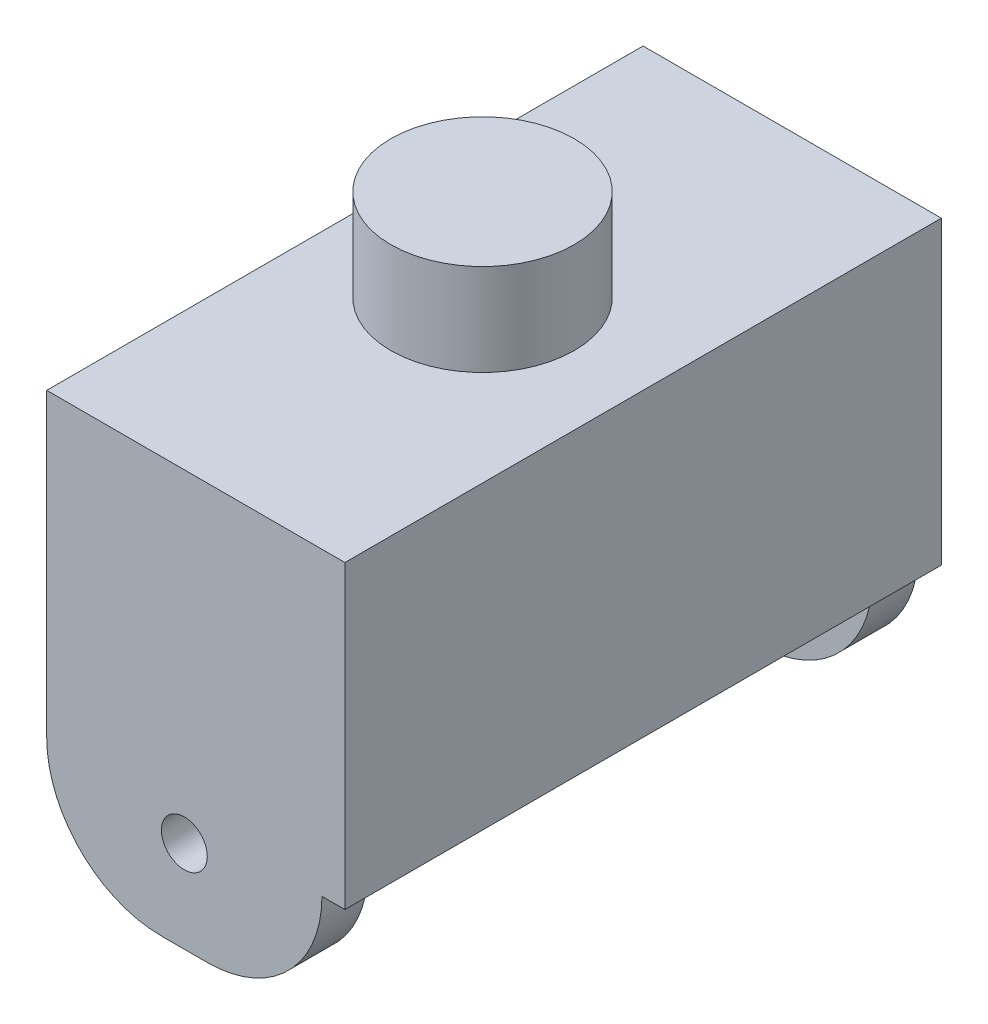
ISO-10303-21;
HEADER;
FILE_DESCRIPTION(('STEP AP214'),'2;1');
FILE_NAME('part.step','',(''),(''),'','','');
FILE_SCHEMA(('AUTOMOTIVE_DESIGN { 1 0 10303 214 1 1 1 1 }'));
ENDSEC;
DATA;
#1=APPLICATION_CONTEXT('core data for automotive mechanical design processes');
#2=APPLICATION_PROTOCOL_DEFINITION('international standard','automotive_design',2000,#1);
#3=PRODUCT_CONTEXT('',#1,'mechanical');
#4=PRODUCT('Part','Part','',(#3));
#5=PRODUCT_RELATED_PRODUCT_CATEGORY('part','',(#4));
#6=PRODUCT_DEFINITION_FORMATION('','',#4);
#7=PRODUCT_DEFINITION_CONTEXT('part definition',#1,'design');
#8=PRODUCT_DEFINITION('design','',#6,#7);
#9=PRODUCT_DEFINITION_SHAPE('','',#8);
#10=(LENGTH_UNIT() NAMED_UNIT(*) SI_UNIT(.MILLI.,.METRE.));
#11=(NAMED_UNIT(*) PLANE_ANGLE_UNIT() SI_UNIT($,.RADIAN.));
#12=(NAMED_UNIT(*) SI_UNIT($,.STERADIAN.) SOLID_ANGLE_UNIT());
#13=UNCERTAINTY_MEASURE_WITH_UNIT(LENGTH_MEASURE(1.E-05),#10,'distance_accuracy_value','');
#14=(GEOMETRIC_REPRESENTATION_CONTEXT(3) GLOBAL_UNCERTAINTY_ASSIGNED_CONTEXT((#13)) GLOBAL_UNIT_ASSIGNED_CONTEXT((#10,
#11,#12)) REPRESENTATION_CONTEXT('',''));
#15=CARTESIAN_POINT('',(0.,0.,0.));
#16=DIRECTION('',(0.,0.,1.));
#17=DIRECTION('',(1.,0.,0.));
#18=AXIS2_PLACEMENT_3D('',#15,#16,#17);
#19=CARTESIAN_POINT('',(-4.99999999999999,-25.,0.));
#20=DIRECTION('',(0.,0.,1.));
#21=DIRECTION('',(1.,0.,0.));
#22=AXIS2_PLACEMENT_3D('',#19,#20,#21);
#23=PLANE('',#22);
#24=CARTESIAN_POINT('',(0.,-30.,0.));
#25=DIRECTION('',(0.,0.,1.));
#26=DIRECTION('',(1.,0.,0.));
#27=AXIS2_PLACEMENT_3D('',#24,#25,#26);
#28=CIRCLE('',#27,5.);
#29=CARTESIAN_POINT('',(5.00000000000001,-30.,0.));
#30=VERTEX_POINT('',#29);
#31=EDGE_CURVE('E232',#30,#30,#28,.T.);
#32=ORIENTED_EDGE('',*,*,#31,.T.);
#33=EDGE_LOOP('',(#32));
#34=FACE_BOUND('',#33,.T.);
#35=DIRECTION('',(-1.,0.,0.));
#36=VECTOR('',#35,1.);
#37=CARTESIAN_POINT('',(-30.,30.5119118435241,0.));
#38=LINE('',#37,#36);
#39=CARTESIAN_POINT('',(25.,30.5119118435241,0.));
#40=VERTEX_POINT('',#39);
#41=CARTESIAN_POINT('',(-30.,30.5119118435241,0.));
#42=VERTEX_POINT('',#41);
#43=EDGE_CURVE('E50',#40,#42,#38,.T.);
#44=ORIENTED_EDGE('',*,*,#43,.F.);
#45=DIRECTION('',(0.,1.,0.));
#46=VECTOR('',#45,1.);
#47=CARTESIAN_POINT('',(25.,30.5119118435241,0.));
#48=LINE('',#47,#46);
#49=CARTESIAN_POINT('',(25.,-25.,0.));
#50=VERTEX_POINT('',#49);
#51=EDGE_CURVE('E220',#50,#40,#48,.T.);
#52=ORIENTED_EDGE('',*,*,#51,.F.);
#53=DIRECTION('',(-1.,0.,0.));
#54=VECTOR('',#53,1.);
#55=CARTESIAN_POINT('',(30.,-25.,0.));
#56=LINE('',#55,#54);
#57=CARTESIAN_POINT('',(30.,-25.,0.));
#58=VERTEX_POINT('',#57);
#59=EDGE_CURVE('E218',#58,#50,#56,.T.);
#60=ORIENTED_EDGE('',*,*,#59,.F.);
#61=CARTESIAN_POINT('',(5.00000000000001,-25.,0.));
#62=DIRECTION('',(0.,0.,1.));
#63=DIRECTION('',(1.,0.,0.));
#64=AXIS2_PLACEMENT_3D('',#61,#62,#63);
#65=CIRCLE('',#64,25.);
#66=CARTESIAN_POINT('',(5.,-50.,0.));
#67=VERTEX_POINT('',#66);
#68=EDGE_CURVE('E241',#67,#58,#65,.T.);
#69=ORIENTED_EDGE('',*,*,#68,.F.);
#70=DIRECTION('',(1.,0.,0.));
#71=VECTOR('',#70,1.);
#72=CARTESIAN_POINT('',(-4.99999999999999,-50.,0.));
#73=LINE('',#72,#71);
#74=CARTESIAN_POINT('',(-4.99999999999999,-50.,0.));
#75=VERTEX_POINT('',#74);
#76=EDGE_CURVE('E252',#75,#67,#73,.T.);
#77=ORIENTED_EDGE('',*,*,#76,.F.);
#78=CARTESIAN_POINT('',(-4.99999999999999,-25.,0.));
#79=DIRECTION('',(0.,0.,1.));
#80=DIRECTION('',(1.,0.,0.));
#81=AXIS2_PLACEMENT_3D('',#78,#79,#80);
#82=CIRCLE('',#81,25.);
#83=CARTESIAN_POINT('',(-30.,-25.,0.));
#84=VERTEX_POINT('',#83);
#85=EDGE_CURVE('E250',#84,#75,#82,.T.);
#86=ORIENTED_EDGE('',*,*,#85,.F.);
#87=DIRECTION('',(0.,-1.,0.));
#88=VECTOR('',#87,1.);
#89=CARTESIAN_POINT('',(-30.,40.5119118435241,0.));
#90=LINE('',#89,#88);
#91=EDGE_CURVE('E55',#42,#84,#90,.T.);
#92=ORIENTED_EDGE('',*,*,#91,.F.);
#93=EDGE_LOOP('',(#44,#52,#60,#69,#77,#86,#92));
#94=FACE_BOUND('',#93,.T.);
#95=ADVANCED_FACE('F34',(#34,#94),#23,.F.);
#96=CARTESIAN_POINT('',(-4.99999999999999,-25.,10.));
#97=DIRECTION('',(0.,0.,1.));
#98=DIRECTION('',(1.,0.,0.));
#99=AXIS2_PLACEMENT_3D('',#96,#97,#98);
#100=PLANE('',#99);
#101=DIRECTION('',(0.,-1.,0.));
#102=VECTOR('',#101,1.);
#103=CARTESIAN_POINT('',(-30.,40.5119118435241,10.));
#104=LINE('',#103,#102);
#105=CARTESIAN_POINT('',(-30.,40.5119118435241,10.));
#106=VERTEX_POINT('',#105);
#107=CARTESIAN_POINT('',(-30.,-25.,10.));
#108=VERTEX_POINT('',#107);
#109=EDGE_CURVE('E238',#106,#108,#104,.T.);
#110=ORIENTED_EDGE('',*,*,#109,.T.);
#111=CARTESIAN_POINT('',(-4.99999999999999,-25.,10.));
#112=DIRECTION('',(0.,0.,1.));
#113=DIRECTION('',(1.,0.,0.));
#114=AXIS2_PLACEMENT_3D('',#111,#112,#113);
#115=CIRCLE('',#114,25.);
#116=CARTESIAN_POINT('',(-4.99999999999999,-50.,10.));
#117=VERTEX_POINT('',#116);
#118=EDGE_CURVE('E240',#108,#117,#115,.T.);
#119=ORIENTED_EDGE('',*,*,#118,.T.);
#120=DIRECTION('',(1.,0.,0.));
#121=VECTOR('',#120,1.);
#122=CARTESIAN_POINT('',(-4.99999999999999,-50.,10.));
#123=LINE('',#122,#121);
#124=CARTESIAN_POINT('',(5.,-50.,10.));
#125=VERTEX_POINT('',#124);
#126=EDGE_CURVE('E243',#117,#125,#123,.T.);
#127=ORIENTED_EDGE('',*,*,#126,.T.);
#128=CARTESIAN_POINT('',(5.00000000000001,-25.,10.));
#129=DIRECTION('',(0.,0.,1.));
#130=DIRECTION('',(1.,0.,0.));
#131=AXIS2_PLACEMENT_3D('',#128,#129,#130);
#132=CIRCLE('',#131,25.);
#133=CARTESIAN_POINT('',(30.,-25.,10.));
#134=VERTEX_POINT('',#133);
#135=EDGE_CURVE('E159',#125,#134,#132,.T.);
#136=ORIENTED_EDGE('',*,*,#135,.T.);
#137=DIRECTION('',(-1.,0.,0.));
#138=VECTOR('',#137,1.);
#139=CARTESIAN_POINT('',(35.,-25.,10.));
#140=LINE('',#139,#138);
#141=CARTESIAN_POINT('',(35.,-25.,10.));
#142=VERTEX_POINT('',#141);
#143=EDGE_CURVE('E138',#142,#134,#140,.T.);
#144=ORIENTED_EDGE('',*,*,#143,.F.);
#145=DIRECTION('',(0.,-1.,0.));
#146=VECTOR('',#145,1.);
#147=CARTESIAN_POINT('',(35.,-25.,10.));
#148=LINE('',#147,#146);
#149=CARTESIAN_POINT('',(35.,40.5119118435241,10.));
#150=VERTEX_POINT('',#149);
#151=EDGE_CURVE('E146',#150,#142,#148,.T.);
#152=ORIENTED_EDGE('',*,*,#151,.F.);
#153=DIRECTION('',(-1.,0.,0.));
#154=VECTOR('',#153,1.);
#155=CARTESIAN_POINT('',(-30.,40.5119118435241,10.));
#156=LINE('',#155,#154);
#157=EDGE_CURVE('E246',#150,#106,#156,.T.);
#158=ORIENTED_EDGE('',*,*,#157,.T.);
#159=EDGE_LOOP('',(#110,#119,#127,#136,#144,#152,#158));
#160=FACE_BOUND('',#159,.T.);
#161=CARTESIAN_POINT('',(0.,-30.,10.));
#162=DIRECTION('',(0.,0.,1.));
#163=DIRECTION('',(1.,0.,0.));
#164=AXIS2_PLACEMENT_3D('',#161,#162,#163);
#165=CIRCLE('',#164,5.);
#166=CARTESIAN_POINT('',(5.00000000000001,-30.,10.));
#167=VERTEX_POINT('',#166);
#168=EDGE_CURVE('E233',#167,#167,#165,.T.);
#169=ORIENTED_EDGE('',*,*,#168,.F.);
#170=EDGE_LOOP('',(#169));
#171=FACE_BOUND('',#170,.T.);
#172=ADVANCED_FACE('F156',(#160,#171),#100,.T.);
#173=CARTESIAN_POINT('',(-30.,40.5119118435241,10.));
#174=DIRECTION('',(1.,0.,0.));
#175=DIRECTION('',(0.,1.,0.));
#176=AXIS2_PLACEMENT_3D('',#173,#174,#175);
#177=PLANE('',#176);
#178=DIRECTION('',(0.,0.,-1.));
#179=VECTOR('',#178,1.);
#180=CARTESIAN_POINT('',(-30.,40.5119118435241,10.));
#181=LINE('',#180,#179);
#182=CARTESIAN_POINT('',(-30.,40.5119118435241,-120.));
#183=VERTEX_POINT('',#182);
#184=EDGE_CURVE('E248',#106,#183,#181,.T.);
#185=ORIENTED_EDGE('',*,*,#184,.T.);
#186=DIRECTION('',(0.,-1.,0.));
#187=VECTOR('',#186,1.);
#188=CARTESIAN_POINT('',(-30.,40.5119118435241,-120.));
#189=LINE('',#188,#187);
#190=CARTESIAN_POINT('',(-30.,-25.,-120.));
#191=VERTEX_POINT('',#190);
#192=EDGE_CURVE('E184',#183,#191,#189,.T.);
#193=ORIENTED_EDGE('',*,*,#192,.T.);
#194=DIRECTION('',(0.,0.,1.));
#195=VECTOR('',#194,1.);
#196=CARTESIAN_POINT('',(-30.,-25.,-120.));
#197=LINE('',#196,#195);
#198=CARTESIAN_POINT('',(-30.,-25.,-110.));
#199=VERTEX_POINT('',#198);
#200=EDGE_CURVE('E216',#191,#199,#197,.T.);
#201=ORIENTED_EDGE('',*,*,#200,.T.);
#202=DIRECTION('',(0.,-1.,0.));
#203=VECTOR('',#202,1.);
#204=CARTESIAN_POINT('',(-30.,40.5119118435241,-110.));
#205=LINE('',#204,#203);
#206=CARTESIAN_POINT('',(-30.,30.5119118435241,-110.));
#207=VERTEX_POINT('',#206);
#208=EDGE_CURVE('E181',#207,#199,#205,.T.);
#209=ORIENTED_EDGE('',*,*,#208,.F.);
#210=DIRECTION('',(0.,0.,1.));
#211=VECTOR('',#210,1.);
#212=CARTESIAN_POINT('',(-30.,30.5119118435241,-55.));
#213=LINE('',#212,#211);
#214=EDGE_CURVE('E223',#207,#42,#213,.T.);
#215=ORIENTED_EDGE('',*,*,#214,.T.);
#216=ORIENTED_EDGE('',*,*,#91,.T.);
#217=DIRECTION('',(0.,0.,-1.));
#218=VECTOR('',#217,1.);
#219=CARTESIAN_POINT('',(-30.,-25.,10.));
#220=LINE('',#219,#218);
#221=EDGE_CURVE('E38',#108,#84,#220,.T.);
#222=ORIENTED_EDGE('',*,*,#221,.F.);
#223=ORIENTED_EDGE('',*,*,#109,.F.);
#224=EDGE_LOOP('',(#185,#193,#201,#209,#215,#216,#222,#223));
#225=FACE_BOUND('',#224,.T.);
#226=ADVANCED_FACE('F36',(#225),#177,.F.);
#227=CARTESIAN_POINT('',(-4.99999999999999,-25.,10.));
#228=DIRECTION('',(0.,0.,-1.));
#229=DIRECTION('',(-1.,0.,0.));
#230=AXIS2_PLACEMENT_3D('',#227,#228,#229);
#231=CYLINDRICAL_SURFACE('',#230,25.);
#232=ORIENTED_EDGE('',*,*,#85,.T.);
#233=DIRECTION('',(0.,0.,-1.));
#234=VECTOR('',#233,1.);
#235=CARTESIAN_POINT('',(-4.99999999999999,-50.,10.));
#236=LINE('',#235,#234);
#237=EDGE_CURVE('E261',#117,#75,#236,.T.);
#238=ORIENTED_EDGE('',*,*,#237,.F.);
#239=ORIENTED_EDGE('',*,*,#118,.F.);
#240=ORIENTED_EDGE('',*,*,#221,.T.);
#241=EDGE_LOOP('',(#232,#238,#239,#240));
#242=FACE_BOUND('',#241,.T.);
#243=ADVANCED_FACE('F270',(#242),#231,.T.);
#244=CARTESIAN_POINT('',(-4.99999999999999,-50.,10.));
#245=DIRECTION('',(0.,1.,0.));
#246=DIRECTION('',(-1.,0.,0.));
#247=AXIS2_PLACEMENT_3D('',#244,#245,#246);
#248=PLANE('',#247);
#249=ORIENTED_EDGE('',*,*,#76,.T.);
#250=DIRECTION('',(0.,0.,-1.));
#251=VECTOR('',#250,1.);
#252=CARTESIAN_POINT('',(5.,-50.,10.));
#253=LINE('',#252,#251);
#254=EDGE_CURVE('E259',#125,#67,#253,.T.);
#255=ORIENTED_EDGE('',*,*,#254,.F.);
#256=ORIENTED_EDGE('',*,*,#126,.F.);
#257=ORIENTED_EDGE('',*,*,#237,.T.);
#258=EDGE_LOOP('',(#249,#255,#256,#257));
#259=FACE_BOUND('',#258,.T.);
#260=ADVANCED_FACE('F277',(#259),#248,.F.);
#261=CARTESIAN_POINT('',(5.00000000000001,-25.,10.));
#262=DIRECTION('',(0.,0.,-1.));
#263=DIRECTION('',(-1.,0.,0.));
#264=AXIS2_PLACEMENT_3D('',#261,#262,#263);
#265=CYLINDRICAL_SURFACE('',#264,25.);
#266=ORIENTED_EDGE('',*,*,#68,.T.);
#267=DIRECTION('',(0.,0.,-1.));
#268=VECTOR('',#267,1.);
#269=CARTESIAN_POINT('',(30.,-25.,10.));
#270=LINE('',#269,#268);
#271=EDGE_CURVE('E257',#134,#58,#270,.T.);
#272=ORIENTED_EDGE('',*,*,#271,.F.);
#273=ORIENTED_EDGE('',*,*,#135,.F.);
#274=ORIENTED_EDGE('',*,*,#254,.T.);
#275=EDGE_LOOP('',(#266,#272,#273,#274));
#276=FACE_BOUND('',#275,.T.);
#277=ADVANCED_FACE('F279',(#276),#265,.T.);
#278=CARTESIAN_POINT('',(-30.,40.5119118435241,10.));
#279=DIRECTION('',(0.,-1.,0.));
#280=DIRECTION('',(0.,0.,-1.));
#281=AXIS2_PLACEMENT_3D('',#278,#279,#280);
#282=PLANE('',#281);
#283=CARTESIAN_POINT('',(0.,40.5119118435241,-55.));
#284=DIRECTION('',(0.,1.,0.));
#285=DIRECTION('',(0.,0.,1.));
#286=AXIS2_PLACEMENT_3D('',#283,#284,#285);
#287=CIRCLE('',#286,20.);
#288=CARTESIAN_POINT('',(0.,40.5119118435241,-35.));
#289=VERTEX_POINT('',#288);
#290=EDGE_CURVE('E11',#289,#289,#287,.T.);
#291=ORIENTED_EDGE('',*,*,#290,.F.);
#292=EDGE_LOOP('',(#291));
#293=FACE_BOUND('',#292,.T.);
#294=ORIENTED_EDGE('',*,*,#157,.F.);
#295=DIRECTION('',(0.,0.,1.));
#296=VECTOR('',#295,1.);
#297=CARTESIAN_POINT('',(35.,40.5119118435241,10.));
#298=LINE('',#297,#296);
#299=CARTESIAN_POINT('',(35.,40.5119118435241,-120.));
#300=VERTEX_POINT('',#299);
#301=EDGE_CURVE('E152',#300,#150,#298,.T.);
#302=ORIENTED_EDGE('',*,*,#301,.F.);
#303=DIRECTION('',(-1.,0.,0.));
#304=VECTOR('',#303,1.);
#305=CARTESIAN_POINT('',(-30.,40.5119118435241,-120.));
#306=LINE('',#305,#304);
#307=EDGE_CURVE('E197',#300,#183,#306,.T.);
#308=ORIENTED_EDGE('',*,*,#307,.T.);
#309=ORIENTED_EDGE('',*,*,#184,.F.);
#310=EDGE_LOOP('',(#294,#302,#308,#309));
#311=FACE_BOUND('',#310,.T.);
#312=ADVANCED_FACE('F306',(#293,#311),#282,.F.);
#313=CARTESIAN_POINT('',(0.,-30.,10.));
#314=DIRECTION('',(0.,0.,-1.));
#315=DIRECTION('',(-1.,0.,0.));
#316=AXIS2_PLACEMENT_3D('',#313,#314,#315);
#317=CYLINDRICAL_SURFACE('',#316,5.);
#318=ORIENTED_EDGE('',*,*,#168,.T.);
#319=EDGE_LOOP('',(#318));
#320=FACE_BOUND('',#319,.T.);
#321=ORIENTED_EDGE('',*,*,#31,.F.);
#322=EDGE_LOOP('',(#321));
#323=FACE_BOUND('',#322,.T.);
#324=ADVANCED_FACE('F309',(#320,#323),#317,.F.);
#325=CARTESIAN_POINT('',(30.,-25.,-55.));
#326=DIRECTION('',(0.,1.,0.));
#327=DIRECTION('',(0.,0.,1.));
#328=AXIS2_PLACEMENT_3D('',#325,#326,#327);
#329=PLANE('',#328);
#330=ORIENTED_EDGE('',*,*,#59,.T.);
#331=DIRECTION('',(0.,0.,1.));
#332=VECTOR('',#331,1.);
#333=CARTESIAN_POINT('',(25.,-25.,-55.));
#334=LINE('',#333,#332);
#335=CARTESIAN_POINT('',(25.,-25.,-110.));
#336=VERTEX_POINT('',#335);
#337=EDGE_CURVE('E229',#336,#50,#334,.T.);
#338=ORIENTED_EDGE('',*,*,#337,.F.);
#339=DIRECTION('',(-1.,0.,0.));
#340=VECTOR('',#339,1.);
#341=CARTESIAN_POINT('',(30.,-25.,-110.));
#342=LINE('',#341,#340);
#343=CARTESIAN_POINT('',(30.,-25.,-110.));
#344=VERTEX_POINT('',#343);
#345=EDGE_CURVE('E164',#344,#336,#342,.T.);
#346=ORIENTED_EDGE('',*,*,#345,.F.);
#347=DIRECTION('',(0.,0.,1.));
#348=VECTOR('',#347,1.);
#349=CARTESIAN_POINT('',(30.,-25.,-120.));
#350=LINE('',#349,#348);
#351=CARTESIAN_POINT('',(30.,-25.,-120.));
#352=VERTEX_POINT('',#351);
#353=EDGE_CURVE('E200',#352,#344,#350,.T.);
#354=ORIENTED_EDGE('',*,*,#353,.F.);
#355=DIRECTION('',(-1.,0.,0.));
#356=VECTOR('',#355,1.);
#357=CARTESIAN_POINT('',(35.,-25.,-120.));
#358=LINE('',#357,#356);
#359=CARTESIAN_POINT('',(35.,-25.,-120.));
#360=VERTEX_POINT('',#359);
#361=EDGE_CURVE('E141',#360,#352,#358,.T.);
#362=ORIENTED_EDGE('',*,*,#361,.F.);
#363=DIRECTION('',(0.,0.,-1.));
#364=VECTOR('',#363,1.);
#365=CARTESIAN_POINT('',(35.,-25.,-120.));
#366=LINE('',#365,#364);
#367=EDGE_CURVE('E133',#142,#360,#366,.T.);
#368=ORIENTED_EDGE('',*,*,#367,.F.);
#369=ORIENTED_EDGE('',*,*,#143,.T.);
#370=ORIENTED_EDGE('',*,*,#271,.T.);
#371=EDGE_LOOP('',(#330,#338,#346,#354,#362,#368,#369,#370));
#372=FACE_BOUND('',#371,.T.);
#373=ADVANCED_FACE('F136',(#372),#329,.F.);
#374=CARTESIAN_POINT('',(25.,30.5119118435241,-55.));
#375=DIRECTION('',(1.,0.,0.));
#376=DIRECTION('',(0.,1.,0.));
#377=AXIS2_PLACEMENT_3D('',#374,#375,#376);
#378=PLANE('',#377);
#379=ORIENTED_EDGE('',*,*,#51,.T.);
#380=DIRECTION('',(0.,0.,1.));
#381=VECTOR('',#380,1.);
#382=CARTESIAN_POINT('',(25.,30.5119118435241,-55.));
#383=LINE('',#382,#381);
#384=CARTESIAN_POINT('',(25.,30.5119118435241,-110.));
#385=VERTEX_POINT('',#384);
#386=EDGE_CURVE('E226',#385,#40,#383,.T.);
#387=ORIENTED_EDGE('',*,*,#386,.F.);
#388=DIRECTION('',(0.,1.,0.));
#389=VECTOR('',#388,1.);
#390=CARTESIAN_POINT('',(25.,30.5119118435241,-110.));
#391=LINE('',#390,#389);
#392=EDGE_CURVE('E171',#336,#385,#391,.T.);
#393=ORIENTED_EDGE('',*,*,#392,.F.);
#394=ORIENTED_EDGE('',*,*,#337,.T.);
#395=EDGE_LOOP('',(#379,#387,#393,#394));
#396=FACE_BOUND('',#395,.T.);
#397=ADVANCED_FACE('F281',(#396),#378,.F.);
#398=CARTESIAN_POINT('',(-30.,30.5119118435241,-55.));
#399=DIRECTION('',(0.,1.,0.));
#400=DIRECTION('',(-1.,0.,0.));
#401=AXIS2_PLACEMENT_3D('',#398,#399,#400);
#402=PLANE('',#401);
#403=ORIENTED_EDGE('',*,*,#43,.T.);
#404=ORIENTED_EDGE('',*,*,#214,.F.);
#405=DIRECTION('',(-1.,0.,0.));
#406=VECTOR('',#405,1.);
#407=CARTESIAN_POINT('',(-30.,30.5119118435241,-110.));
#408=LINE('',#407,#406);
#409=EDGE_CURVE('E174',#385,#207,#408,.T.);
#410=ORIENTED_EDGE('',*,*,#409,.F.);
#411=ORIENTED_EDGE('',*,*,#386,.T.);
#412=EDGE_LOOP('',(#403,#404,#410,#411));
#413=FACE_BOUND('',#412,.T.);
#414=ADVANCED_FACE('F285',(#413),#402,.F.);
#415=CARTESIAN_POINT('',(-4.99999999999999,-25.,-110.));
#416=DIRECTION('',(0.,0.,-1.));
#417=DIRECTION('',(1.,0.,0.));
#418=AXIS2_PLACEMENT_3D('',#415,#416,#417);
#419=PLANE('',#418);
#420=CARTESIAN_POINT('',(0.,-30.,-110.));
#421=DIRECTION('',(0.,0.,1.));
#422=DIRECTION('',(1.,0.,0.));
#423=AXIS2_PLACEMENT_3D('',#420,#421,#422);
#424=CIRCLE('',#423,5.);
#425=CARTESIAN_POINT('',(5.00000000000001,-30.,-110.));
#426=VERTEX_POINT('',#425);
#427=EDGE_CURVE('E177',#426,#426,#424,.T.);
#428=ORIENTED_EDGE('',*,*,#427,.F.);
#429=EDGE_LOOP('',(#428));
#430=FACE_BOUND('',#429,.T.);
#431=ORIENTED_EDGE('',*,*,#409,.T.);
#432=ORIENTED_EDGE('',*,*,#208,.T.);
#433=CARTESIAN_POINT('',(-4.99999999999999,-25.,-110.));
#434=DIRECTION('',(0.,0.,1.));
#435=DIRECTION('',(1.,0.,0.));
#436=AXIS2_PLACEMENT_3D('',#433,#434,#435);
#437=CIRCLE('',#436,25.);
#438=CARTESIAN_POINT('',(-4.99999999999999,-50.,-110.));
#439=VERTEX_POINT('',#438);
#440=EDGE_CURVE('E203',#199,#439,#437,.T.);
#441=ORIENTED_EDGE('',*,*,#440,.T.);
#442=DIRECTION('',(1.,0.,0.));
#443=VECTOR('',#442,1.);
#444=CARTESIAN_POINT('',(-4.99999999999999,-50.,-110.));
#445=LINE('',#444,#443);
#446=CARTESIAN_POINT('',(5.,-50.,-110.));
#447=VERTEX_POINT('',#446);
#448=EDGE_CURVE('E206',#439,#447,#445,.T.);
#449=ORIENTED_EDGE('',*,*,#448,.T.);
#450=CARTESIAN_POINT('',(5.00000000000001,-25.,-110.));
#451=DIRECTION('',(0.,0.,1.));
#452=DIRECTION('',(1.,0.,0.));
#453=AXIS2_PLACEMENT_3D('',#450,#451,#452);
#454=CIRCLE('',#453,25.);
#455=EDGE_CURVE('E188',#447,#344,#454,.T.);
#456=ORIENTED_EDGE('',*,*,#455,.T.);
#457=ORIENTED_EDGE('',*,*,#345,.T.);
#458=ORIENTED_EDGE('',*,*,#392,.T.);
#459=EDGE_LOOP('',(#431,#432,#441,#449,#456,#457,#458));
#460=FACE_BOUND('',#459,.T.);
#461=ADVANCED_FACE('F287',(#430,#460),#419,.F.);
#462=CARTESIAN_POINT('',(-4.99999999999999,-25.,-120.));
#463=DIRECTION('',(0.,0.,-1.));
#464=DIRECTION('',(1.,0.,0.));
#465=AXIS2_PLACEMENT_3D('',#462,#463,#464);
#466=PLANE('',#465);
#467=ORIENTED_EDGE('',*,*,#192,.F.);
#468=ORIENTED_EDGE('',*,*,#307,.F.);
#469=DIRECTION('',(0.,1.,0.));
#470=VECTOR('',#469,1.);
#471=CARTESIAN_POINT('',(35.,40.5119118435241,-120.));
#472=LINE('',#471,#470);
#473=EDGE_CURVE('E145',#360,#300,#472,.T.);
#474=ORIENTED_EDGE('',*,*,#473,.F.);
#475=ORIENTED_EDGE('',*,*,#361,.T.);
#476=CARTESIAN_POINT('',(5.00000000000001,-25.,-120.));
#477=DIRECTION('',(0.,0.,1.));
#478=DIRECTION('',(1.,0.,0.));
#479=AXIS2_PLACEMENT_3D('',#476,#477,#478);
#480=CIRCLE('',#479,25.);
#481=CARTESIAN_POINT('',(5.,-50.,-120.));
#482=VERTEX_POINT('',#481);
#483=EDGE_CURVE('E194',#482,#352,#480,.T.);
#484=ORIENTED_EDGE('',*,*,#483,.F.);
#485=DIRECTION('',(1.,0.,0.));
#486=VECTOR('',#485,1.);
#487=CARTESIAN_POINT('',(-4.99999999999999,-50.,-120.));
#488=LINE('',#487,#486);
#489=CARTESIAN_POINT('',(-4.99999999999999,-50.,-120.));
#490=VERTEX_POINT('',#489);
#491=EDGE_CURVE('E191',#490,#482,#488,.T.);
#492=ORIENTED_EDGE('',*,*,#491,.F.);
#493=CARTESIAN_POINT('',(-4.99999999999999,-25.,-120.));
#494=DIRECTION('',(0.,0.,1.));
#495=DIRECTION('',(1.,0.,0.));
#496=AXIS2_PLACEMENT_3D('',#493,#494,#495);
#497=CIRCLE('',#496,25.);
#498=EDGE_CURVE('E187',#191,#490,#497,.T.);
#499=ORIENTED_EDGE('',*,*,#498,.F.);
#500=EDGE_LOOP('',(#467,#468,#474,#475,#484,#492,#499));
#501=FACE_BOUND('',#500,.T.);
#502=CARTESIAN_POINT('',(0.,-30.,-120.));
#503=DIRECTION('',(0.,0.,1.));
#504=DIRECTION('',(1.,0.,0.));
#505=AXIS2_PLACEMENT_3D('',#502,#503,#504);
#506=CIRCLE('',#505,5.);
#507=CARTESIAN_POINT('',(5.00000000000001,-30.,-120.));
#508=VERTEX_POINT('',#507);
#509=EDGE_CURVE('E178',#508,#508,#506,.T.);
#510=ORIENTED_EDGE('',*,*,#509,.T.);
#511=EDGE_LOOP('',(#510));
#512=FACE_BOUND('',#511,.T.);
#513=ADVANCED_FACE('F294',(#501,#512),#466,.T.);
#514=CARTESIAN_POINT('',(-4.99999999999999,-25.,-120.));
#515=DIRECTION('',(0.,0.,1.));
#516=DIRECTION('',(-1.,0.,0.));
#517=AXIS2_PLACEMENT_3D('',#514,#515,#516);
#518=CYLINDRICAL_SURFACE('',#517,25.);
#519=ORIENTED_EDGE('',*,*,#440,.F.);
#520=ORIENTED_EDGE('',*,*,#200,.F.);
#521=ORIENTED_EDGE('',*,*,#498,.T.);
#522=DIRECTION('',(0.,0.,1.));
#523=VECTOR('',#522,1.);
#524=CARTESIAN_POINT('',(-4.99999999999999,-50.,-120.));
#525=LINE('',#524,#523);
#526=EDGE_CURVE('E214',#490,#439,#525,.T.);
#527=ORIENTED_EDGE('',*,*,#526,.T.);
#528=EDGE_LOOP('',(#519,#520,#521,#527));
#529=FACE_BOUND('',#528,.T.);
#530=ADVANCED_FACE('F336',(#529),#518,.T.);
#531=CARTESIAN_POINT('',(-4.99999999999999,-50.,-120.));
#532=DIRECTION('',(0.,1.,0.));
#533=DIRECTION('',(-1.,0.,0.));
#534=AXIS2_PLACEMENT_3D('',#531,#532,#533);
#535=PLANE('',#534);
#536=ORIENTED_EDGE('',*,*,#448,.F.);
#537=ORIENTED_EDGE('',*,*,#526,.F.);
#538=ORIENTED_EDGE('',*,*,#491,.T.);
#539=DIRECTION('',(0.,0.,1.));
#540=VECTOR('',#539,1.);
#541=CARTESIAN_POINT('',(5.,-50.,-120.));
#542=LINE('',#541,#540);
#543=EDGE_CURVE('E212',#482,#447,#542,.T.);
#544=ORIENTED_EDGE('',*,*,#543,.T.);
#545=EDGE_LOOP('',(#536,#537,#538,#544));
#546=FACE_BOUND('',#545,.T.);
#547=ADVANCED_FACE('F300',(#546),#535,.F.);
#548=CARTESIAN_POINT('',(5.00000000000001,-25.,-120.));
#549=DIRECTION('',(0.,0.,1.));
#550=DIRECTION('',(-1.,0.,0.));
#551=AXIS2_PLACEMENT_3D('',#548,#549,#550);
#552=CYLINDRICAL_SURFACE('',#551,25.);
#553=ORIENTED_EDGE('',*,*,#455,.F.);
#554=ORIENTED_EDGE('',*,*,#543,.F.);
#555=ORIENTED_EDGE('',*,*,#483,.T.);
#556=ORIENTED_EDGE('',*,*,#353,.T.);
#557=EDGE_LOOP('',(#553,#554,#555,#556));
#558=FACE_BOUND('',#557,.T.);
#559=ADVANCED_FACE('F297',(#558),#552,.T.);
#560=CARTESIAN_POINT('',(0.,-30.,-120.));
#561=DIRECTION('',(0.,0.,1.));
#562=DIRECTION('',(-1.,0.,0.));
#563=AXIS2_PLACEMENT_3D('',#560,#561,#562);
#564=CYLINDRICAL_SURFACE('',#563,5.);
#565=ORIENTED_EDGE('',*,*,#509,.F.);
#566=EDGE_LOOP('',(#565));
#567=FACE_BOUND('',#566,.T.);
#568=ORIENTED_EDGE('',*,*,#427,.T.);
#569=EDGE_LOOP('',(#568));
#570=FACE_BOUND('',#569,.T.);
#571=ADVANCED_FACE('F343',(#567,#570),#564,.F.);
#572=CARTESIAN_POINT('',(0.,60.5119118435241,-55.));
#573=DIRECTION('',(0.,-1.,0.));
#574=DIRECTION('',(0.,0.,-1.));
#575=AXIS2_PLACEMENT_3D('',#572,#573,#574);
#576=CYLINDRICAL_SURFACE('',#575,20.);
#577=CARTESIAN_POINT('',(0.,60.5119118435241,-55.));
#578=DIRECTION('',(0.,1.,0.));
#579=DIRECTION('',(0.,0.,1.));
#580=AXIS2_PLACEMENT_3D('',#577,#578,#579);
#581=CIRCLE('',#580,20.);
#582=CARTESIAN_POINT('',(0.,60.5119118435241,-35.));
#583=VERTEX_POINT('',#582);
#584=EDGE_CURVE('E161',#583,#583,#581,.T.);
#585=ORIENTED_EDGE('',*,*,#584,.F.);
#586=EDGE_LOOP('',(#585));
#587=FACE_BOUND('',#586,.T.);
#588=ORIENTED_EDGE('',*,*,#290,.T.);
#589=EDGE_LOOP('',(#588));
#590=FACE_BOUND('',#589,.T.);
#591=ADVANCED_FACE('F351',(#587,#590),#576,.T.);
#592=CARTESIAN_POINT('',(0.,60.5119118435241,-55.));
#593=DIRECTION('',(0.,1.,0.));
#594=DIRECTION('',(0.,0.,1.));
#595=AXIS2_PLACEMENT_3D('',#592,#593,#594);
#596=PLANE('',#595);
#597=ORIENTED_EDGE('',*,*,#584,.T.);
#598=EDGE_LOOP('',(#597));
#599=FACE_BOUND('',#598,.T.);
#600=ADVANCED_FACE('F355',(#599),#596,.T.);
#601=CARTESIAN_POINT('',(35.,0.,0.));
#602=DIRECTION('',(-1.,0.,0.));
#603=DIRECTION('',(0.,-1.,0.));
#604=AXIS2_PLACEMENT_3D('',#601,#602,#603);
#605=PLANE('',#604);
#606=ORIENTED_EDGE('',*,*,#151,.T.);
#607=ORIENTED_EDGE('',*,*,#367,.T.);
#608=ORIENTED_EDGE('',*,*,#473,.T.);
#609=ORIENTED_EDGE('',*,*,#301,.T.);
#610=EDGE_LOOP('',(#606,#607,#608,#609));
#611=FACE_BOUND('',#610,.T.);
#612=ADVANCED_FACE('F150',(#611),#605,.F.);
#613=CLOSED_SHELL('',(#95,#172,#226,#243,#260,#277,#312,#324,#373,#397,#414,#461,#513,#530,#547,
#559,#571,#591,#600,#612));
#614=MANIFOLD_SOLID_BREP('B2',#613);
#615=ADVANCED_BREP_SHAPE_REPRESENTATION('',(#18,#614),#14);
#616=SHAPE_DEFINITION_REPRESENTATION(#9,#615);
ENDSEC;
END-ISO-10303-21;
